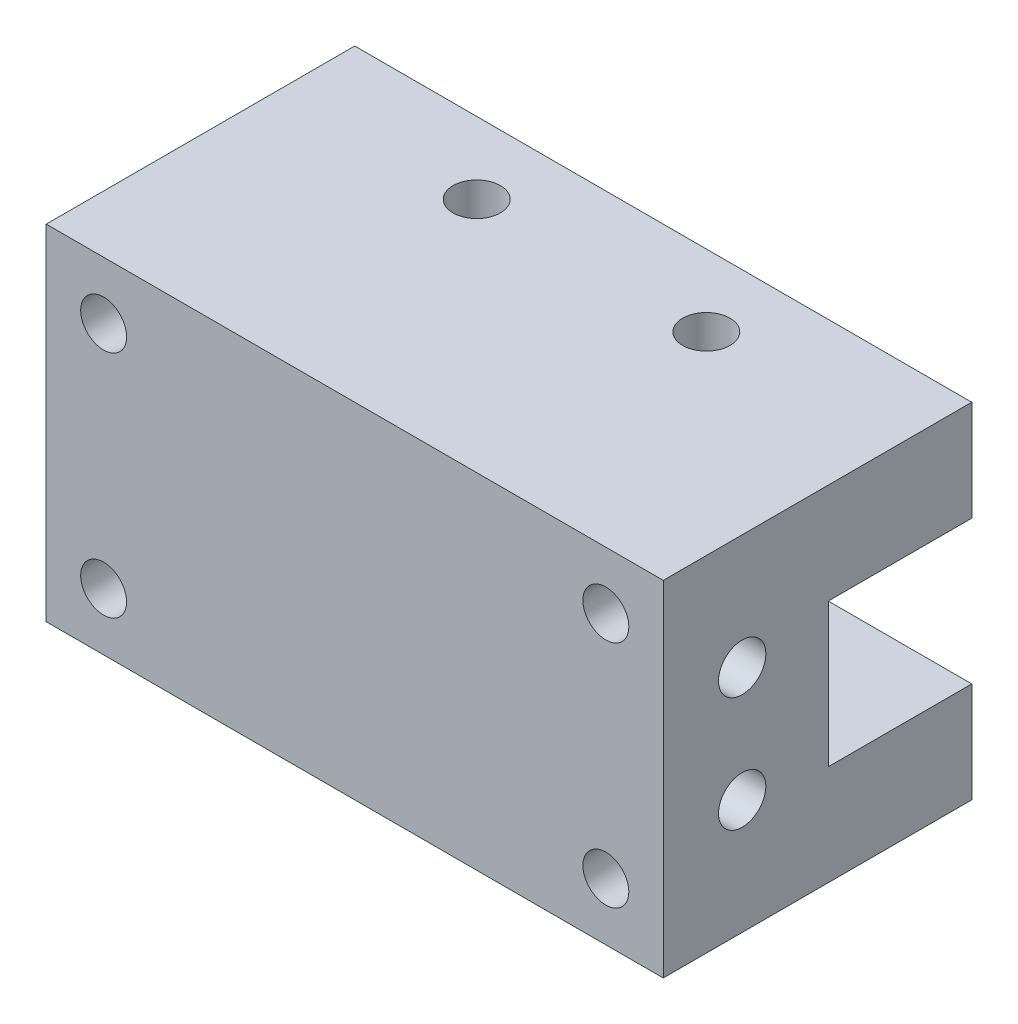
ISO-10303-21;
HEADER;
FILE_DESCRIPTION(('STEP AP214'),'2;1');
FILE_NAME('part.step','',(''),(''),'','','');
FILE_SCHEMA(('AUTOMOTIVE_DESIGN { 1 0 10303 214 1 1 1 1 }'));
ENDSEC;
DATA;
#1=APPLICATION_CONTEXT('core data for automotive mechanical design processes');
#2=APPLICATION_PROTOCOL_DEFINITION('international standard','automotive_design',2000,#1);
#3=PRODUCT_CONTEXT('',#1,'mechanical');
#4=PRODUCT('Part','Part','',(#3));
#5=PRODUCT_RELATED_PRODUCT_CATEGORY('part','',(#4));
#6=PRODUCT_DEFINITION_FORMATION('','',#4);
#7=PRODUCT_DEFINITION_CONTEXT('part definition',#1,'design');
#8=PRODUCT_DEFINITION('design','',#6,#7);
#9=PRODUCT_DEFINITION_SHAPE('','',#8);
#10=(LENGTH_UNIT() NAMED_UNIT(*) SI_UNIT(.MILLI.,.METRE.));
#11=(NAMED_UNIT(*) PLANE_ANGLE_UNIT() SI_UNIT($,.RADIAN.));
#12=(NAMED_UNIT(*) SI_UNIT($,.STERADIAN.) SOLID_ANGLE_UNIT());
#13=UNCERTAINTY_MEASURE_WITH_UNIT(LENGTH_MEASURE(1.E-05),#10,'distance_accuracy_value','');
#14=(GEOMETRIC_REPRESENTATION_CONTEXT(3) GLOBAL_UNCERTAINTY_ASSIGNED_CONTEXT((#13)) GLOBAL_UNIT_ASSIGNED_CONTEXT((#10,
#11,#12)) REPRESENTATION_CONTEXT('',''));
#15=CARTESIAN_POINT('',(0.,0.,0.));
#16=DIRECTION('',(0.,0.,1.));
#17=DIRECTION('',(1.,0.,0.));
#18=AXIS2_PLACEMENT_3D('',#15,#16,#17);
#19=CARTESIAN_POINT('',(21.5,12.,11.5));
#20=DIRECTION('',(0.,-1.,0.));
#21=DIRECTION('',(1.,0.,0.));
#22=AXIS2_PLACEMENT_3D('',#19,#20,#21);
#23=PLANE('',#22);
#24=CARTESIAN_POINT('',(-8.,12.,-5.));
#25=DIRECTION('',(0.,1.,0.));
#26=DIRECTION('',(0.,0.,1.));
#27=AXIS2_PLACEMENT_3D('',#24,#25,#26);
#28=CIRCLE('',#27,1.64999999999999);
#29=CARTESIAN_POINT('',(-8.,12.,-3.35000000000001));
#30=VERTEX_POINT('',#29);
#31=EDGE_CURVE('E131',#30,#30,#28,.T.);
#32=ORIENTED_EDGE('',*,*,#31,.F.);
#33=EDGE_LOOP('',(#32));
#34=FACE_BOUND('',#33,.T.);
#35=DIRECTION('',(0.,0.,-1.));
#36=VECTOR('',#35,1.);
#37=CARTESIAN_POINT('',(21.5,12.,11.5));
#38=LINE('',#37,#36);
#39=CARTESIAN_POINT('',(21.5,12.,11.5));
#40=VERTEX_POINT('',#39);
#41=CARTESIAN_POINT('',(21.5,12.,-10.));
#42=VERTEX_POINT('',#41);
#43=EDGE_CURVE('E241',#40,#42,#38,.T.);
#44=ORIENTED_EDGE('',*,*,#43,.T.);
#45=DIRECTION('',(1.,0.,0.));
#46=VECTOR('',#45,1.);
#47=CARTESIAN_POINT('',(-21.5,12.,-10.));
#48=LINE('',#47,#46);
#49=CARTESIAN_POINT('',(-21.5,12.,-10.));
#50=VERTEX_POINT('',#49);
#51=EDGE_CURVE('E160',#50,#42,#48,.T.);
#52=ORIENTED_EDGE('',*,*,#51,.F.);
#53=DIRECTION('',(0.,0.,-1.));
#54=VECTOR('',#53,1.);
#55=CARTESIAN_POINT('',(-21.5,12.,11.5));
#56=LINE('',#55,#54);
#57=CARTESIAN_POINT('',(-21.5,12.,11.5));
#58=VERTEX_POINT('',#57);
#59=EDGE_CURVE('E236',#58,#50,#56,.T.);
#60=ORIENTED_EDGE('',*,*,#59,.F.);
#61=DIRECTION('',(-1.,0.,0.));
#62=VECTOR('',#61,1.);
#63=CARTESIAN_POINT('',(21.5,12.,11.5));
#64=LINE('',#63,#62);
#65=EDGE_CURVE('E61',#40,#58,#64,.T.);
#66=ORIENTED_EDGE('',*,*,#65,.F.);
#67=EDGE_LOOP('',(#44,#52,#60,#66));
#68=FACE_BOUND('',#67,.T.);
#69=CARTESIAN_POINT('',(8.,12.,-5.));
#70=DIRECTION('',(0.,1.,0.));
#71=DIRECTION('',(0.,0.,1.));
#72=AXIS2_PLACEMENT_3D('',#69,#70,#71);
#73=CIRCLE('',#72,1.64999999999999);
#74=CARTESIAN_POINT('',(8.,12.,-3.35000000000001));
#75=VERTEX_POINT('',#74);
#76=EDGE_CURVE('E137',#75,#75,#73,.T.);
#77=ORIENTED_EDGE('',*,*,#76,.F.);
#78=EDGE_LOOP('',(#77));
#79=FACE_BOUND('',#78,.T.);
#80=ADVANCED_FACE('F36',(#34,#68,#79),#23,.F.);
#81=CARTESIAN_POINT('',(0.,0.,0.));
#82=DIRECTION('',(0.,0.,-1.));
#83=DIRECTION('',(-1.,0.,0.));
#84=AXIS2_PLACEMENT_3D('',#81,#82,#83);
#85=PLANE('',#84);
#86=CARTESIAN_POINT('',(-17.5,8.,0.));
#87=DIRECTION('',(0.,0.,1.));
#88=DIRECTION('',(1.,0.,0.));
#89=AXIS2_PLACEMENT_3D('',#86,#87,#88);
#90=CIRCLE('',#89,1.6);
#91=CARTESIAN_POINT('',(-15.9,8.,0.));
#92=VERTEX_POINT('',#91);
#93=EDGE_CURVE('E220',#92,#92,#90,.T.);
#94=ORIENTED_EDGE('',*,*,#93,.T.);
#95=EDGE_LOOP('',(#94));
#96=FACE_BOUND('',#95,.T.);
#97=CARTESIAN_POINT('',(-17.5,8.,0.));
#98=DIRECTION('',(0.,0.,-1.));
#99=DIRECTION('',(-1.,0.,0.));
#100=AXIS2_PLACEMENT_3D('',#97,#98,#99);
#101=CIRCLE('',#100,2.75);
#102=CARTESIAN_POINT('',(-20.25,8.,0.));
#103=VERTEX_POINT('',#102);
#104=EDGE_CURVE('E11',#103,#103,#101,.F.);
#105=ORIENTED_EDGE('',*,*,#104,.F.);
#106=EDGE_LOOP('',(#105));
#107=FACE_BOUND('',#106,.T.);
#108=ADVANCED_FACE('F300',(#96,#107),#85,.T.);
#109=CARTESIAN_POINT('',(17.5,8.,0.));
#110=DIRECTION('',(0.,0.,1.));
#111=DIRECTION('',(1.,0.,0.));
#112=AXIS2_PLACEMENT_3D('',#109,#110,#111);
#113=CIRCLE('',#112,1.6);
#114=CARTESIAN_POINT('',(19.1,8.,0.));
#115=VERTEX_POINT('',#114);
#116=EDGE_CURVE('E204',#115,#115,#113,.T.);
#117=ORIENTED_EDGE('',*,*,#116,.T.);
#118=EDGE_LOOP('',(#117));
#119=FACE_BOUND('',#118,.T.);
#120=CARTESIAN_POINT('',(17.5,8.,0.));
#121=DIRECTION('',(0.,0.,-1.));
#122=DIRECTION('',(-1.,0.,0.));
#123=AXIS2_PLACEMENT_3D('',#120,#121,#122);
#124=CIRCLE('',#123,2.75);
#125=CARTESIAN_POINT('',(14.75,8.,0.));
#126=VERTEX_POINT('',#125);
#127=EDGE_CURVE('E45',#126,#126,#124,.F.);
#128=ORIENTED_EDGE('',*,*,#127,.F.);
#129=EDGE_LOOP('',(#128));
#130=FACE_BOUND('',#129,.T.);
#131=ADVANCED_FACE('F309',(#119,#130),#85,.T.);
#132=CARTESIAN_POINT('',(17.5,-8.,0.));
#133=DIRECTION('',(0.,0.,1.));
#134=DIRECTION('',(1.,0.,0.));
#135=AXIS2_PLACEMENT_3D('',#132,#133,#134);
#136=CIRCLE('',#135,1.6);
#137=CARTESIAN_POINT('',(19.1,-8.,0.));
#138=VERTEX_POINT('',#137);
#139=EDGE_CURVE('E208',#138,#138,#136,.T.);
#140=ORIENTED_EDGE('',*,*,#139,.T.);
#141=EDGE_LOOP('',(#140));
#142=FACE_BOUND('',#141,.T.);
#143=CARTESIAN_POINT('',(17.5,-8.,0.));
#144=DIRECTION('',(0.,0.,-1.));
#145=DIRECTION('',(-1.,0.,0.));
#146=AXIS2_PLACEMENT_3D('',#143,#144,#145);
#147=CIRCLE('',#146,2.75);
#148=CARTESIAN_POINT('',(14.75,-8.,0.));
#149=VERTEX_POINT('',#148);
#150=EDGE_CURVE('E176',#149,#149,#147,.T.);
#151=ORIENTED_EDGE('',*,*,#150,.T.);
#152=EDGE_LOOP('',(#151));
#153=FACE_BOUND('',#152,.T.);
#154=ADVANCED_FACE('F312',(#142,#153),#85,.T.);
#155=CARTESIAN_POINT('',(-17.5,-8.,0.));
#156=DIRECTION('',(0.,0.,1.));
#157=DIRECTION('',(1.,0.,0.));
#158=AXIS2_PLACEMENT_3D('',#155,#156,#157);
#159=CIRCLE('',#158,1.6);
#160=CARTESIAN_POINT('',(-15.9,-8.,0.));
#161=VERTEX_POINT('',#160);
#162=EDGE_CURVE('E214',#161,#161,#159,.T.);
#163=ORIENTED_EDGE('',*,*,#162,.T.);
#164=EDGE_LOOP('',(#163));
#165=FACE_BOUND('',#164,.T.);
#166=CARTESIAN_POINT('',(-17.5,-8.,0.));
#167=DIRECTION('',(0.,0.,-1.));
#168=DIRECTION('',(-1.,0.,0.));
#169=AXIS2_PLACEMENT_3D('',#166,#167,#168);
#170=CIRCLE('',#169,2.75);
#171=CARTESIAN_POINT('',(-20.25,-8.,0.));
#172=VERTEX_POINT('',#171);
#173=EDGE_CURVE('E172',#172,#172,#170,.T.);
#174=ORIENTED_EDGE('',*,*,#173,.T.);
#175=EDGE_LOOP('',(#174));
#176=FACE_BOUND('',#175,.T.);
#177=ADVANCED_FACE('F301',(#165,#176),#85,.T.);
#178=CARTESIAN_POINT('',(0.,0.,11.5));
#179=DIRECTION('',(0.,0.,-1.));
#180=DIRECTION('',(-1.,0.,0.));
#181=AXIS2_PLACEMENT_3D('',#178,#179,#180);
#182=PLANE('',#181);
#183=DIRECTION('',(0.,-1.,0.));
#184=VECTOR('',#183,1.);
#185=CARTESIAN_POINT('',(-21.5,12.,11.5));
#186=LINE('',#185,#184);
#187=CARTESIAN_POINT('',(-21.5,-12.,11.5));
#188=VERTEX_POINT('',#187);
#189=EDGE_CURVE('E228',#58,#188,#186,.T.);
#190=ORIENTED_EDGE('',*,*,#189,.T.);
#191=DIRECTION('',(1.,0.,0.));
#192=VECTOR('',#191,1.);
#193=CARTESIAN_POINT('',(21.5,-12.,11.5));
#194=LINE('',#193,#192);
#195=CARTESIAN_POINT('',(21.5,-12.,11.5));
#196=VERTEX_POINT('',#195);
#197=EDGE_CURVE('E230',#188,#196,#194,.T.);
#198=ORIENTED_EDGE('',*,*,#197,.T.);
#199=DIRECTION('',(0.,1.,0.));
#200=VECTOR('',#199,1.);
#201=CARTESIAN_POINT('',(21.5,12.,11.5));
#202=LINE('',#201,#200);
#203=EDGE_CURVE('E233',#196,#40,#202,.T.);
#204=ORIENTED_EDGE('',*,*,#203,.T.);
#205=ORIENTED_EDGE('',*,*,#65,.T.);
#206=EDGE_LOOP('',(#190,#198,#204,#205));
#207=FACE_BOUND('',#206,.T.);
#208=CARTESIAN_POINT('',(-17.5,8.,11.5));
#209=DIRECTION('',(0.,0.,1.));
#210=DIRECTION('',(1.,0.,0.));
#211=AXIS2_PLACEMENT_3D('',#208,#209,#210);
#212=CIRCLE('',#211,1.6);
#213=CARTESIAN_POINT('',(-15.9,8.,11.5));
#214=VERTEX_POINT('',#213);
#215=EDGE_CURVE('E223',#214,#214,#212,.T.);
#216=ORIENTED_EDGE('',*,*,#215,.F.);
#217=EDGE_LOOP('',(#216));
#218=FACE_BOUND('',#217,.T.);
#219=CARTESIAN_POINT('',(-17.5,-8.,11.5));
#220=DIRECTION('',(0.,0.,1.));
#221=DIRECTION('',(1.,0.,0.));
#222=AXIS2_PLACEMENT_3D('',#219,#220,#221);
#223=CIRCLE('',#222,1.6);
#224=CARTESIAN_POINT('',(-15.9,-8.,11.5));
#225=VERTEX_POINT('',#224);
#226=EDGE_CURVE('E217',#225,#225,#223,.T.);
#227=ORIENTED_EDGE('',*,*,#226,.F.);
#228=EDGE_LOOP('',(#227));
#229=FACE_BOUND('',#228,.T.);
#230=CARTESIAN_POINT('',(17.5,-8.,11.5));
#231=DIRECTION('',(0.,0.,1.));
#232=DIRECTION('',(1.,0.,0.));
#233=AXIS2_PLACEMENT_3D('',#230,#231,#232);
#234=CIRCLE('',#233,1.6);
#235=CARTESIAN_POINT('',(19.1,-8.,11.5));
#236=VERTEX_POINT('',#235);
#237=EDGE_CURVE('E211',#236,#236,#234,.T.);
#238=ORIENTED_EDGE('',*,*,#237,.F.);
#239=EDGE_LOOP('',(#238));
#240=FACE_BOUND('',#239,.T.);
#241=CARTESIAN_POINT('',(17.5,8.,11.5));
#242=DIRECTION('',(0.,0.,1.));
#243=DIRECTION('',(1.,0.,0.));
#244=AXIS2_PLACEMENT_3D('',#241,#242,#243);
#245=CIRCLE('',#244,1.6);
#246=CARTESIAN_POINT('',(19.1,8.,11.5));
#247=VERTEX_POINT('',#246);
#248=EDGE_CURVE('E205',#247,#247,#245,.T.);
#249=ORIENTED_EDGE('',*,*,#248,.F.);
#250=EDGE_LOOP('',(#249));
#251=FACE_BOUND('',#250,.T.);
#252=ADVANCED_FACE('F281',(#207,#218,#229,#240,#251),#182,.F.);
#253=DIRECTION('',(0.,-1.,0.));
#254=VECTOR('',#253,1.);
#255=CARTESIAN_POINT('',(-21.5,12.,0.));
#256=LINE('',#255,#254);
#257=CARTESIAN_POINT('',(-21.5,5.,0.));
#258=VERTEX_POINT('',#257);
#259=CARTESIAN_POINT('',(-21.5,-5.,0.));
#260=VERTEX_POINT('',#259);
#261=EDGE_CURVE('E53',#258,#260,#256,.T.);
#262=ORIENTED_EDGE('',*,*,#261,.F.);
#263=DIRECTION('',(-1.,0.,0.));
#264=VECTOR('',#263,1.);
#265=CARTESIAN_POINT('',(-21.5,5.,0.));
#266=LINE('',#265,#264);
#267=CARTESIAN_POINT('',(21.5,5.,0.));
#268=VERTEX_POINT('',#267);
#269=EDGE_CURVE('E156',#268,#258,#266,.T.);
#270=ORIENTED_EDGE('',*,*,#269,.F.);
#271=DIRECTION('',(0.,1.,0.));
#272=VECTOR('',#271,1.);
#273=CARTESIAN_POINT('',(21.5,12.,0.));
#274=LINE('',#273,#272);
#275=CARTESIAN_POINT('',(21.5,-5.,0.));
#276=VERTEX_POINT('',#275);
#277=EDGE_CURVE('E231',#276,#268,#274,.T.);
#278=ORIENTED_EDGE('',*,*,#277,.F.);
#279=DIRECTION('',(1.,0.,0.));
#280=VECTOR('',#279,1.);
#281=CARTESIAN_POINT('',(-21.5,-5.,0.));
#282=LINE('',#281,#280);
#283=EDGE_CURVE('E182',#260,#276,#282,.T.);
#284=ORIENTED_EDGE('',*,*,#283,.F.);
#285=EDGE_LOOP('',(#262,#270,#278,#284));
#286=FACE_BOUND('',#285,.T.);
#287=ADVANCED_FACE('F297',(#286),#85,.T.);
#288=CARTESIAN_POINT('',(-21.5,12.,11.5));
#289=DIRECTION('',(1.,0.,0.));
#290=DIRECTION('',(0.,1.,0.));
#291=AXIS2_PLACEMENT_3D('',#288,#289,#290);
#292=PLANE('',#291);
#293=ORIENTED_EDGE('',*,*,#59,.T.);
#294=DIRECTION('',(0.,1.,0.));
#295=VECTOR('',#294,1.);
#296=CARTESIAN_POINT('',(-21.5,12.,-10.));
#297=LINE('',#296,#295);
#298=CARTESIAN_POINT('',(-21.5,5.,-10.));
#299=VERTEX_POINT('',#298);
#300=EDGE_CURVE('E157',#299,#50,#297,.T.);
#301=ORIENTED_EDGE('',*,*,#300,.F.);
#302=DIRECTION('',(0.,0.,1.));
#303=VECTOR('',#302,1.);
#304=CARTESIAN_POINT('',(-21.5,5.,-10.));
#305=LINE('',#304,#303);
#306=EDGE_CURVE('E167',#299,#258,#305,.T.);
#307=ORIENTED_EDGE('',*,*,#306,.T.);
#308=ORIENTED_EDGE('',*,*,#261,.T.);
#309=DIRECTION('',(0.,0.,1.));
#310=VECTOR('',#309,1.);
#311=CARTESIAN_POINT('',(-21.5,-5.,-10.));
#312=LINE('',#311,#310);
#313=CARTESIAN_POINT('',(-21.5,-5.,-10.));
#314=VERTEX_POINT('',#313);
#315=EDGE_CURVE('E201',#314,#260,#312,.T.);
#316=ORIENTED_EDGE('',*,*,#315,.F.);
#317=DIRECTION('',(0.,1.,0.));
#318=VECTOR('',#317,1.);
#319=CARTESIAN_POINT('',(-21.5,-12.,-10.));
#320=LINE('',#319,#318);
#321=CARTESIAN_POINT('',(-21.5,-12.,-10.));
#322=VERTEX_POINT('',#321);
#323=EDGE_CURVE('E185',#322,#314,#320,.T.);
#324=ORIENTED_EDGE('',*,*,#323,.F.);
#325=DIRECTION('',(0.,0.,-1.));
#326=VECTOR('',#325,1.);
#327=CARTESIAN_POINT('',(-21.5,-12.,11.5));
#328=LINE('',#327,#326);
#329=EDGE_CURVE('E245',#188,#322,#328,.T.);
#330=ORIENTED_EDGE('',*,*,#329,.F.);
#331=ORIENTED_EDGE('',*,*,#189,.F.);
#332=EDGE_LOOP('',(#293,#301,#307,#308,#316,#324,#330,#331));
#333=FACE_BOUND('',#332,.T.);
#334=ADVANCED_FACE('F38',(#333),#292,.F.);
#335=CARTESIAN_POINT('',(21.5,-12.,11.5));
#336=DIRECTION('',(0.,1.,0.));
#337=DIRECTION('',(-1.,0.,0.));
#338=AXIS2_PLACEMENT_3D('',#335,#336,#337);
#339=PLANE('',#338);
#340=CARTESIAN_POINT('',(-8.,-12.,-5.));
#341=DIRECTION('',(0.,1.,0.));
#342=DIRECTION('',(-1.,0.,0.));
#343=AXIS2_PLACEMENT_3D('',#340,#341,#342);
#344=CIRCLE('',#343,2.1);
#345=CARTESIAN_POINT('',(-10.1,-12.,-5.));
#346=VERTEX_POINT('',#345);
#347=EDGE_CURVE('E143',#346,#346,#344,.T.);
#348=ORIENTED_EDGE('',*,*,#347,.T.);
#349=EDGE_LOOP('',(#348));
#350=FACE_BOUND('',#349,.T.);
#351=CARTESIAN_POINT('',(8.,-12.,-5.));
#352=DIRECTION('',(0.,1.,0.));
#353=DIRECTION('',(-1.,0.,0.));
#354=AXIS2_PLACEMENT_3D('',#351,#352,#353);
#355=CIRCLE('',#354,2.1);
#356=CARTESIAN_POINT('',(5.9,-12.,-5.));
#357=VERTEX_POINT('',#356);
#358=EDGE_CURVE('E147',#357,#357,#355,.T.);
#359=ORIENTED_EDGE('',*,*,#358,.T.);
#360=EDGE_LOOP('',(#359));
#361=FACE_BOUND('',#360,.T.);
#362=ORIENTED_EDGE('',*,*,#329,.T.);
#363=DIRECTION('',(-1.,0.,0.));
#364=VECTOR('',#363,1.);
#365=CARTESIAN_POINT('',(-21.5,-12.,-10.));
#366=LINE('',#365,#364);
#367=CARTESIAN_POINT('',(21.5,-12.,-10.));
#368=VERTEX_POINT('',#367);
#369=EDGE_CURVE('E193',#368,#322,#366,.T.);
#370=ORIENTED_EDGE('',*,*,#369,.F.);
#371=DIRECTION('',(0.,0.,-1.));
#372=VECTOR('',#371,1.);
#373=CARTESIAN_POINT('',(21.5,-12.,11.5));
#374=LINE('',#373,#372);
#375=EDGE_CURVE('E243',#196,#368,#374,.T.);
#376=ORIENTED_EDGE('',*,*,#375,.F.);
#377=ORIENTED_EDGE('',*,*,#197,.F.);
#378=EDGE_LOOP('',(#362,#370,#376,#377));
#379=FACE_BOUND('',#378,.T.);
#380=ADVANCED_FACE('F262',(#350,#361,#379),#339,.F.);
#381=CARTESIAN_POINT('',(21.5,12.,11.5));
#382=DIRECTION('',(-1.,0.,0.));
#383=DIRECTION('',(0.,-1.,0.));
#384=AXIS2_PLACEMENT_3D('',#381,#382,#383);
#385=PLANE('',#384);
#386=CARTESIAN_POINT('',(21.5,4.,6.));
#387=DIRECTION('',(1.,0.,0.));
#388=DIRECTION('',(0.,0.,-1.));
#389=AXIS2_PLACEMENT_3D('',#386,#387,#388);
#390=CIRCLE('',#389,1.65);
#391=CARTESIAN_POINT('',(21.5,4.,4.35));
#392=VERTEX_POINT('',#391);
#393=EDGE_CURVE('E121',#392,#392,#390,.T.);
#394=ORIENTED_EDGE('',*,*,#393,.F.);
#395=EDGE_LOOP('',(#394));
#396=FACE_BOUND('',#395,.T.);
#397=CARTESIAN_POINT('',(21.5,-4.,6.));
#398=DIRECTION('',(1.,0.,0.));
#399=DIRECTION('',(0.,0.,-1.));
#400=AXIS2_PLACEMENT_3D('',#397,#398,#399);
#401=CIRCLE('',#400,1.65);
#402=CARTESIAN_POINT('',(21.5,-4.,4.35));
#403=VERTEX_POINT('',#402);
#404=EDGE_CURVE('E120',#403,#403,#401,.T.);
#405=ORIENTED_EDGE('',*,*,#404,.F.);
#406=EDGE_LOOP('',(#405));
#407=FACE_BOUND('',#406,.T.);
#408=ORIENTED_EDGE('',*,*,#375,.T.);
#409=DIRECTION('',(0.,-1.,0.));
#410=VECTOR('',#409,1.);
#411=CARTESIAN_POINT('',(21.5,-12.,-10.));
#412=LINE('',#411,#410);
#413=CARTESIAN_POINT('',(21.5,-5.,-10.));
#414=VERTEX_POINT('',#413);
#415=EDGE_CURVE('E190',#414,#368,#412,.T.);
#416=ORIENTED_EDGE('',*,*,#415,.F.);
#417=DIRECTION('',(0.,0.,1.));
#418=VECTOR('',#417,1.);
#419=CARTESIAN_POINT('',(21.5,-5.,-10.));
#420=LINE('',#419,#418);
#421=EDGE_CURVE('E196',#414,#276,#420,.T.);
#422=ORIENTED_EDGE('',*,*,#421,.T.);
#423=ORIENTED_EDGE('',*,*,#277,.T.);
#424=DIRECTION('',(0.,0.,1.));
#425=VECTOR('',#424,1.);
#426=CARTESIAN_POINT('',(21.5,5.,-10.));
#427=LINE('',#426,#425);
#428=CARTESIAN_POINT('',(21.5,5.,-10.));
#429=VERTEX_POINT('',#428);
#430=EDGE_CURVE('E170',#429,#268,#427,.T.);
#431=ORIENTED_EDGE('',*,*,#430,.F.);
#432=DIRECTION('',(0.,-1.,0.));
#433=VECTOR('',#432,1.);
#434=CARTESIAN_POINT('',(21.5,12.,-10.));
#435=LINE('',#434,#433);
#436=EDGE_CURVE('E163',#42,#429,#435,.T.);
#437=ORIENTED_EDGE('',*,*,#436,.F.);
#438=ORIENTED_EDGE('',*,*,#43,.F.);
#439=ORIENTED_EDGE('',*,*,#203,.F.);
#440=EDGE_LOOP('',(#408,#416,#422,#423,#431,#437,#438,#439));
#441=FACE_BOUND('',#440,.T.);
#442=ADVANCED_FACE('F265',(#396,#407,#441),#385,.F.);
#443=CARTESIAN_POINT('',(-17.5,8.,11.5));
#444=DIRECTION('',(0.,0.,-1.));
#445=DIRECTION('',(-1.,0.,0.));
#446=AXIS2_PLACEMENT_3D('',#443,#444,#445);
#447=CYLINDRICAL_SURFACE('',#446,1.6);
#448=ORIENTED_EDGE('',*,*,#215,.T.);
#449=EDGE_LOOP('',(#448));
#450=FACE_BOUND('',#449,.T.);
#451=ORIENTED_EDGE('',*,*,#93,.F.);
#452=EDGE_LOOP('',(#451));
#453=FACE_BOUND('',#452,.T.);
#454=ADVANCED_FACE('F321',(#450,#453),#447,.F.);
#455=CARTESIAN_POINT('',(-17.5,-8.,11.5));
#456=DIRECTION('',(0.,0.,-1.));
#457=DIRECTION('',(-1.,0.,0.));
#458=AXIS2_PLACEMENT_3D('',#455,#456,#457);
#459=CYLINDRICAL_SURFACE('',#458,1.6);
#460=ORIENTED_EDGE('',*,*,#226,.T.);
#461=EDGE_LOOP('',(#460));
#462=FACE_BOUND('',#461,.T.);
#463=ORIENTED_EDGE('',*,*,#162,.F.);
#464=EDGE_LOOP('',(#463));
#465=FACE_BOUND('',#464,.T.);
#466=ADVANCED_FACE('F326',(#462,#465),#459,.F.);
#467=CARTESIAN_POINT('',(17.5,-8.,11.5));
#468=DIRECTION('',(0.,0.,-1.));
#469=DIRECTION('',(-1.,0.,0.));
#470=AXIS2_PLACEMENT_3D('',#467,#468,#469);
#471=CYLINDRICAL_SURFACE('',#470,1.6);
#472=ORIENTED_EDGE('',*,*,#237,.T.);
#473=EDGE_LOOP('',(#472));
#474=FACE_BOUND('',#473,.T.);
#475=ORIENTED_EDGE('',*,*,#139,.F.);
#476=EDGE_LOOP('',(#475));
#477=FACE_BOUND('',#476,.T.);
#478=ADVANCED_FACE('F385',(#474,#477),#471,.F.);
#479=CARTESIAN_POINT('',(17.5,8.,11.5));
#480=DIRECTION('',(0.,0.,-1.));
#481=DIRECTION('',(-1.,0.,0.));
#482=AXIS2_PLACEMENT_3D('',#479,#480,#481);
#483=CYLINDRICAL_SURFACE('',#482,1.6);
#484=ORIENTED_EDGE('',*,*,#248,.T.);
#485=EDGE_LOOP('',(#484));
#486=FACE_BOUND('',#485,.T.);
#487=ORIENTED_EDGE('',*,*,#116,.F.);
#488=EDGE_LOOP('',(#487));
#489=FACE_BOUND('',#488,.T.);
#490=ADVANCED_FACE('F378',(#486,#489),#483,.F.);
#491=CARTESIAN_POINT('',(0.,0.,-10.));
#492=DIRECTION('',(0.,0.,-1.));
#493=DIRECTION('',(-1.,0.,0.));
#494=AXIS2_PLACEMENT_3D('',#491,#492,#493);
#495=PLANE('',#494);
#496=CARTESIAN_POINT('',(17.5,-8.,-10.));
#497=DIRECTION('',(0.,0.,-1.));
#498=DIRECTION('',(-1.,0.,0.));
#499=AXIS2_PLACEMENT_3D('',#496,#497,#498);
#500=CIRCLE('',#499,2.75);
#501=CARTESIAN_POINT('',(14.75,-8.,-10.));
#502=VERTEX_POINT('',#501);
#503=EDGE_CURVE('E179',#502,#502,#500,.T.);
#504=ORIENTED_EDGE('',*,*,#503,.F.);
#505=EDGE_LOOP('',(#504));
#506=FACE_BOUND('',#505,.T.);
#507=ORIENTED_EDGE('',*,*,#323,.T.);
#508=DIRECTION('',(1.,0.,0.));
#509=VECTOR('',#508,1.);
#510=CARTESIAN_POINT('',(-21.5,-5.,-10.));
#511=LINE('',#510,#509);
#512=EDGE_CURVE('E188',#314,#414,#511,.T.);
#513=ORIENTED_EDGE('',*,*,#512,.T.);
#514=ORIENTED_EDGE('',*,*,#415,.T.);
#515=ORIENTED_EDGE('',*,*,#369,.T.);
#516=EDGE_LOOP('',(#507,#513,#514,#515));
#517=FACE_BOUND('',#516,.T.);
#518=CARTESIAN_POINT('',(-17.5,-8.,-10.));
#519=DIRECTION('',(0.,0.,-1.));
#520=DIRECTION('',(-1.,0.,0.));
#521=AXIS2_PLACEMENT_3D('',#518,#519,#520);
#522=CIRCLE('',#521,2.75);
#523=CARTESIAN_POINT('',(-20.25,-8.,-10.));
#524=VERTEX_POINT('',#523);
#525=EDGE_CURVE('E173',#524,#524,#522,.T.);
#526=ORIENTED_EDGE('',*,*,#525,.F.);
#527=EDGE_LOOP('',(#526));
#528=FACE_BOUND('',#527,.T.);
#529=ADVANCED_FACE('F273',(#506,#517,#528),#495,.T.);
#530=CARTESIAN_POINT('',(-21.5,-5.,-10.));
#531=DIRECTION('',(0.,-1.,0.));
#532=DIRECTION('',(1.,0.,0.));
#533=AXIS2_PLACEMENT_3D('',#530,#531,#532);
#534=PLANE('',#533);
#535=CARTESIAN_POINT('',(-8.,-5.,-5.));
#536=DIRECTION('',(0.,-1.,0.));
#537=DIRECTION('',(1.,0.,0.));
#538=AXIS2_PLACEMENT_3D('',#535,#536,#537);
#539=CIRCLE('',#538,2.1);
#540=CARTESIAN_POINT('',(-5.9,-5.,-5.));
#541=VERTEX_POINT('',#540);
#542=EDGE_CURVE('E40',#541,#541,#539,.T.);
#543=ORIENTED_EDGE('',*,*,#542,.T.);
#544=EDGE_LOOP('',(#543));
#545=FACE_BOUND('',#544,.T.);
#546=CARTESIAN_POINT('',(8.,-5.,-5.));
#547=DIRECTION('',(0.,-1.,0.));
#548=DIRECTION('',(1.,0.,0.));
#549=AXIS2_PLACEMENT_3D('',#546,#547,#548);
#550=CIRCLE('',#549,2.1);
#551=CARTESIAN_POINT('',(10.1,-5.,-5.));
#552=VERTEX_POINT('',#551);
#553=EDGE_CURVE('E146',#552,#552,#550,.T.);
#554=ORIENTED_EDGE('',*,*,#553,.T.);
#555=EDGE_LOOP('',(#554));
#556=FACE_BOUND('',#555,.T.);
#557=ORIENTED_EDGE('',*,*,#283,.T.);
#558=ORIENTED_EDGE('',*,*,#421,.F.);
#559=ORIENTED_EDGE('',*,*,#512,.F.);
#560=ORIENTED_EDGE('',*,*,#315,.T.);
#561=EDGE_LOOP('',(#557,#558,#559,#560));
#562=FACE_BOUND('',#561,.T.);
#563=ADVANCED_FACE('F251',(#545,#556,#562),#534,.F.);
#564=CARTESIAN_POINT('',(17.5,-8.,-10.));
#565=DIRECTION('',(0.,0.,1.));
#566=DIRECTION('',(1.,0.,0.));
#567=AXIS2_PLACEMENT_3D('',#564,#565,#566);
#568=CYLINDRICAL_SURFACE('',#567,2.75);
#569=ORIENTED_EDGE('',*,*,#503,.T.);
#570=EDGE_LOOP('',(#569));
#571=FACE_BOUND('',#570,.T.);
#572=ORIENTED_EDGE('',*,*,#150,.F.);
#573=EDGE_LOOP('',(#572));
#574=FACE_BOUND('',#573,.T.);
#575=ADVANCED_FACE('F371',(#571,#574),#568,.F.);
#576=CARTESIAN_POINT('',(-17.5,-8.,-10.));
#577=DIRECTION('',(0.,0.,1.));
#578=DIRECTION('',(1.,0.,0.));
#579=AXIS2_PLACEMENT_3D('',#576,#577,#578);
#580=CYLINDRICAL_SURFACE('',#579,2.75);
#581=ORIENTED_EDGE('',*,*,#525,.T.);
#582=EDGE_LOOP('',(#581));
#583=FACE_BOUND('',#582,.T.);
#584=ORIENTED_EDGE('',*,*,#173,.F.);
#585=EDGE_LOOP('',(#584));
#586=FACE_BOUND('',#585,.T.);
#587=ADVANCED_FACE('F365',(#583,#586),#580,.F.);
#588=CARTESIAN_POINT('',(0.,0.,-10.));
#589=DIRECTION('',(0.,0.,1.));
#590=DIRECTION('',(1.,0.,0.));
#591=AXIS2_PLACEMENT_3D('',#588,#589,#590);
#592=PLANE('',#591);
#593=ORIENTED_EDGE('',*,*,#300,.T.);
#594=ORIENTED_EDGE('',*,*,#51,.T.);
#595=ORIENTED_EDGE('',*,*,#436,.T.);
#596=DIRECTION('',(-1.,0.,0.));
#597=VECTOR('',#596,1.);
#598=CARTESIAN_POINT('',(-21.5,5.,-10.));
#599=LINE('',#598,#597);
#600=EDGE_CURVE('E165',#429,#299,#599,.T.);
#601=ORIENTED_EDGE('',*,*,#600,.T.);
#602=EDGE_LOOP('',(#593,#594,#595,#601));
#603=FACE_BOUND('',#602,.T.);
#604=CARTESIAN_POINT('',(-17.5,8.,-10.));
#605=DIRECTION('',(0.,0.,-1.));
#606=DIRECTION('',(-1.,0.,0.));
#607=AXIS2_PLACEMENT_3D('',#604,#605,#606);
#608=CIRCLE('',#607,2.75);
#609=CARTESIAN_POINT('',(-20.25,8.,-10.));
#610=VERTEX_POINT('',#609);
#611=EDGE_CURVE('E153',#610,#610,#608,.T.);
#612=ORIENTED_EDGE('',*,*,#611,.F.);
#613=EDGE_LOOP('',(#612));
#614=FACE_BOUND('',#613,.T.);
#615=CARTESIAN_POINT('',(17.5,8.,-10.));
#616=DIRECTION('',(0.,0.,-1.));
#617=DIRECTION('',(-1.,0.,0.));
#618=AXIS2_PLACEMENT_3D('',#615,#616,#617);
#619=CIRCLE('',#618,2.75);
#620=CARTESIAN_POINT('',(14.75,8.,-10.));
#621=VERTEX_POINT('',#620);
#622=EDGE_CURVE('E150',#621,#621,#619,.T.);
#623=ORIENTED_EDGE('',*,*,#622,.F.);
#624=EDGE_LOOP('',(#623));
#625=FACE_BOUND('',#624,.T.);
#626=ADVANCED_FACE('F288',(#603,#614,#625),#592,.F.);
#627=CARTESIAN_POINT('',(-21.5,5.,-10.));
#628=DIRECTION('',(0.,1.,0.));
#629=DIRECTION('',(-1.,0.,0.));
#630=AXIS2_PLACEMENT_3D('',#627,#628,#629);
#631=PLANE('',#630);
#632=CARTESIAN_POINT('',(-8.,5.,-5.));
#633=DIRECTION('',(0.,1.,0.));
#634=DIRECTION('',(-1.,0.,0.));
#635=AXIS2_PLACEMENT_3D('',#632,#633,#634);
#636=CIRCLE('',#635,1.64999999999999);
#637=CARTESIAN_POINT('',(-9.64999999999999,5.,-5.));
#638=VERTEX_POINT('',#637);
#639=EDGE_CURVE('E134',#638,#638,#636,.T.);
#640=ORIENTED_EDGE('',*,*,#639,.T.);
#641=EDGE_LOOP('',(#640));
#642=FACE_BOUND('',#641,.T.);
#643=CARTESIAN_POINT('',(8.,5.,-5.));
#644=DIRECTION('',(0.,1.,0.));
#645=DIRECTION('',(-1.,0.,0.));
#646=AXIS2_PLACEMENT_3D('',#643,#644,#645);
#647=CIRCLE('',#646,1.64999999999999);
#648=CARTESIAN_POINT('',(6.35000000000001,5.,-5.));
#649=VERTEX_POINT('',#648);
#650=EDGE_CURVE('E140',#649,#649,#647,.T.);
#651=ORIENTED_EDGE('',*,*,#650,.T.);
#652=EDGE_LOOP('',(#651));
#653=FACE_BOUND('',#652,.T.);
#654=ORIENTED_EDGE('',*,*,#269,.T.);
#655=ORIENTED_EDGE('',*,*,#306,.F.);
#656=ORIENTED_EDGE('',*,*,#600,.F.);
#657=ORIENTED_EDGE('',*,*,#430,.T.);
#658=EDGE_LOOP('',(#654,#655,#656,#657));
#659=FACE_BOUND('',#658,.T.);
#660=ADVANCED_FACE('F294',(#642,#653,#659),#631,.F.);
#661=CARTESIAN_POINT('',(-17.5,8.,-10.));
#662=DIRECTION('',(0.,0.,1.));
#663=DIRECTION('',(1.,0.,0.));
#664=AXIS2_PLACEMENT_3D('',#661,#662,#663);
#665=CYLINDRICAL_SURFACE('',#664,2.75);
#666=ORIENTED_EDGE('',*,*,#611,.T.);
#667=EDGE_LOOP('',(#666));
#668=FACE_BOUND('',#667,.T.);
#669=ORIENTED_EDGE('',*,*,#104,.T.);
#670=EDGE_LOOP('',(#669));
#671=FACE_BOUND('',#670,.T.);
#672=ADVANCED_FACE('F358',(#668,#671),#665,.F.);
#673=CARTESIAN_POINT('',(17.5,8.,-10.));
#674=DIRECTION('',(0.,0.,1.));
#675=DIRECTION('',(1.,0.,0.));
#676=AXIS2_PLACEMENT_3D('',#673,#674,#675);
#677=CYLINDRICAL_SURFACE('',#676,2.75);
#678=ORIENTED_EDGE('',*,*,#622,.T.);
#679=EDGE_LOOP('',(#678));
#680=FACE_BOUND('',#679,.T.);
#681=ORIENTED_EDGE('',*,*,#127,.T.);
#682=EDGE_LOOP('',(#681));
#683=FACE_BOUND('',#682,.T.);
#684=ADVANCED_FACE('F258',(#680,#683),#677,.F.);
#685=CARTESIAN_POINT('',(8.,-13.,-5.));
#686=DIRECTION('',(0.,1.,0.));
#687=DIRECTION('',(-1.,0.,0.));
#688=AXIS2_PLACEMENT_3D('',#685,#686,#687);
#689=CYLINDRICAL_SURFACE('',#688,2.1);
#690=ORIENTED_EDGE('',*,*,#553,.F.);
#691=EDGE_LOOP('',(#690));
#692=FACE_BOUND('',#691,.T.);
#693=ORIENTED_EDGE('',*,*,#358,.F.);
#694=EDGE_LOOP('',(#693));
#695=FACE_BOUND('',#694,.T.);
#696=ADVANCED_FACE('F254',(#692,#695),#689,.F.);
#697=CARTESIAN_POINT('',(-8.,-13.,-5.));
#698=DIRECTION('',(0.,1.,0.));
#699=DIRECTION('',(-1.,0.,0.));
#700=AXIS2_PLACEMENT_3D('',#697,#698,#699);
#701=CYLINDRICAL_SURFACE('',#700,2.1);
#702=ORIENTED_EDGE('',*,*,#542,.F.);
#703=EDGE_LOOP('',(#702));
#704=FACE_BOUND('',#703,.T.);
#705=ORIENTED_EDGE('',*,*,#347,.F.);
#706=EDGE_LOOP('',(#705));
#707=FACE_BOUND('',#706,.T.);
#708=ADVANCED_FACE('F257',(#704,#707),#701,.F.);
#709=CARTESIAN_POINT('',(8.,12.,-5.));
#710=DIRECTION('',(0.,1.,0.));
#711=DIRECTION('',(0.,0.,1.));
#712=AXIS2_PLACEMENT_3D('',#709,#710,#711);
#713=CYLINDRICAL_SURFACE('',#712,1.64999999999999);
#714=ORIENTED_EDGE('',*,*,#76,.T.);
#715=EDGE_LOOP('',(#714));
#716=FACE_BOUND('',#715,.T.);
#717=ORIENTED_EDGE('',*,*,#650,.F.);
#718=EDGE_LOOP('',(#717));
#719=FACE_BOUND('',#718,.T.);
#720=ADVANCED_FACE('F348',(#716,#719),#713,.F.);
#721=CARTESIAN_POINT('',(-8.,12.,-5.));
#722=DIRECTION('',(0.,1.,0.));
#723=DIRECTION('',(0.,0.,1.));
#724=AXIS2_PLACEMENT_3D('',#721,#722,#723);
#725=CYLINDRICAL_SURFACE('',#724,1.64999999999999);
#726=ORIENTED_EDGE('',*,*,#31,.T.);
#727=EDGE_LOOP('',(#726));
#728=FACE_BOUND('',#727,.T.);
#729=ORIENTED_EDGE('',*,*,#639,.F.);
#730=EDGE_LOOP('',(#729));
#731=FACE_BOUND('',#730,.T.);
#732=ADVANCED_FACE('F340',(#728,#731),#725,.F.);
#733=CARTESIAN_POINT('',(11.4,-4.,6.));
#734=DIRECTION('',(1.,0.,0.));
#735=DIRECTION('',(0.,0.,-1.));
#736=AXIS2_PLACEMENT_3D('',#733,#734,#735);
#737=CONICAL_SURFACE('',#736,1.65,1.02974425867665);
#738=CARTESIAN_POINT('',(10.4085799786045,-4.,6.));
#739=VERTEX_POINT('',#738);
#740=VERTEX_LOOP('',#739);
#741=FACE_BOUND('',#740,.T.);
#742=CARTESIAN_POINT('',(11.4,-4.,6.));
#743=DIRECTION('',(1.,0.,0.));
#744=DIRECTION('',(0.,0.,-1.));
#745=AXIS2_PLACEMENT_3D('',#742,#743,#744);
#746=CIRCLE('',#745,1.65);
#747=CARTESIAN_POINT('',(11.4,-4.,4.35));
#748=VERTEX_POINT('',#747);
#749=EDGE_CURVE('E124',#748,#748,#746,.T.);
#750=ORIENTED_EDGE('',*,*,#749,.T.);
#751=EDGE_LOOP('',(#750));
#752=FACE_BOUND('',#751,.T.);
#753=ADVANCED_FACE('F334',(#741,#752),#737,.F.);
#754=CARTESIAN_POINT('',(21.5,-4.,6.));
#755=DIRECTION('',(1.,0.,0.));
#756=DIRECTION('',(0.,0.,-1.));
#757=AXIS2_PLACEMENT_3D('',#754,#755,#756);
#758=CYLINDRICAL_SURFACE('',#757,1.65);
#759=ORIENTED_EDGE('',*,*,#749,.F.);
#760=EDGE_LOOP('',(#759));
#761=FACE_BOUND('',#760,.T.);
#762=ORIENTED_EDGE('',*,*,#404,.T.);
#763=EDGE_LOOP('',(#762));
#764=FACE_BOUND('',#763,.T.);
#765=ADVANCED_FACE('F114',(#761,#764),#758,.F.);
#766=CARTESIAN_POINT('',(11.4,4.,6.));
#767=DIRECTION('',(1.,0.,0.));
#768=DIRECTION('',(0.,0.,-1.));
#769=AXIS2_PLACEMENT_3D('',#766,#767,#768);
#770=CONICAL_SURFACE('',#769,1.65,1.02974425867665);
#771=CARTESIAN_POINT('',(10.4085799786045,4.,6.));
#772=VERTEX_POINT('',#771);
#773=VERTEX_LOOP('',#772);
#774=FACE_BOUND('',#773,.T.);
#775=CARTESIAN_POINT('',(11.4,4.,6.));
#776=DIRECTION('',(1.,0.,0.));
#777=DIRECTION('',(0.,0.,-1.));
#778=AXIS2_PLACEMENT_3D('',#775,#776,#777);
#779=CIRCLE('',#778,1.65);
#780=CARTESIAN_POINT('',(11.4,4.,4.35));
#781=VERTEX_POINT('',#780);
#782=EDGE_CURVE('E118',#781,#781,#779,.T.);
#783=ORIENTED_EDGE('',*,*,#782,.T.);
#784=EDGE_LOOP('',(#783));
#785=FACE_BOUND('',#784,.T.);
#786=ADVANCED_FACE('F110',(#774,#785),#770,.F.);
#787=CARTESIAN_POINT('',(21.5,4.,6.));
#788=DIRECTION('',(1.,0.,0.));
#789=DIRECTION('',(0.,0.,-1.));
#790=AXIS2_PLACEMENT_3D('',#787,#788,#789);
#791=CYLINDRICAL_SURFACE('',#790,1.65);
#792=ORIENTED_EDGE('',*,*,#782,.F.);
#793=EDGE_LOOP('',(#792));
#794=FACE_BOUND('',#793,.T.);
#795=ORIENTED_EDGE('',*,*,#393,.T.);
#796=EDGE_LOOP('',(#795));
#797=FACE_BOUND('',#796,.T.);
#798=ADVANCED_FACE('F113',(#794,#797),#791,.F.);
#799=CLOSED_SHELL('',(#80,#108,#131,#154,#177,#252,#287,#334,#380,#442,#454,#466,#478,#490,#529,
#563,#575,#587,#626,#660,#672,#684,#696,#708,#720,#732,#753,#765,#786,#798));
#800=MANIFOLD_SOLID_BREP('B2',#799);
#801=ADVANCED_BREP_SHAPE_REPRESENTATION('',(#18,#800),#14);
#802=SHAPE_DEFINITION_REPRESENTATION(#9,#801);
ENDSEC;
END-ISO-10303-21;
